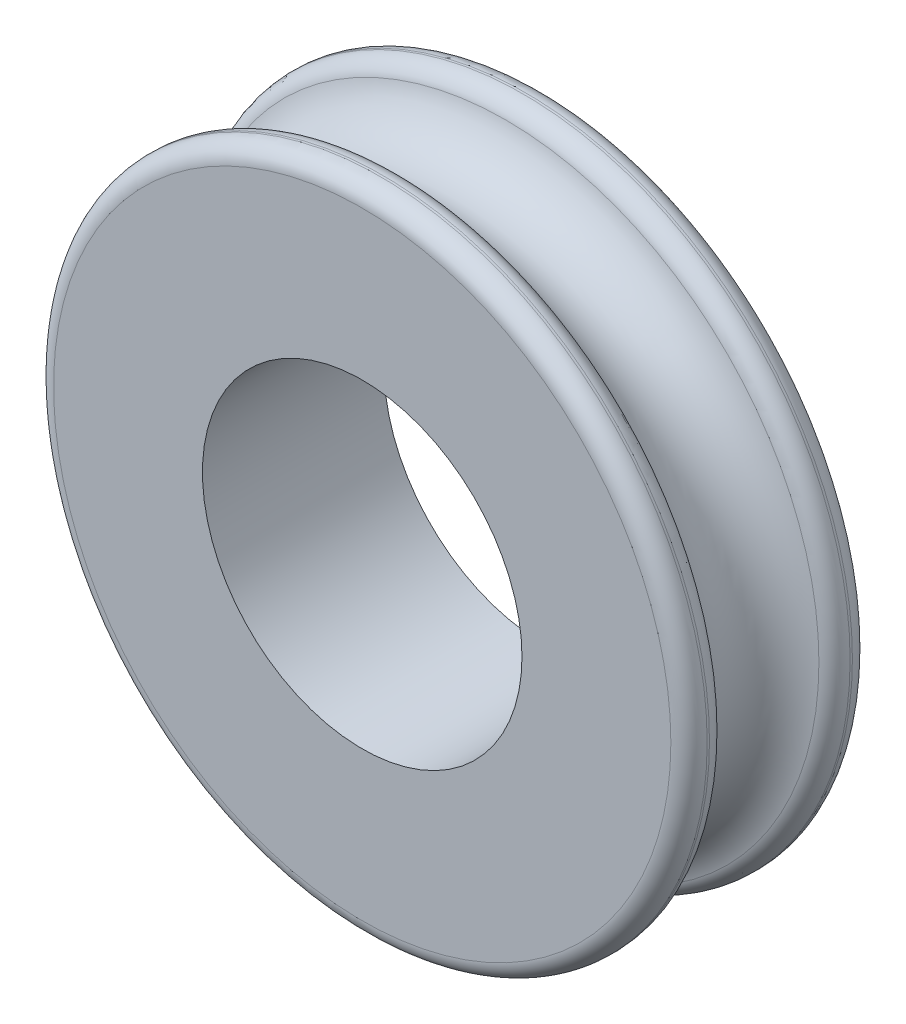
ISO-10303-21;
HEADER;
FILE_DESCRIPTION(('STEP AP214'),'2;1');
FILE_NAME('part.step','',(''),(''),'','','');
FILE_SCHEMA(('AUTOMOTIVE_DESIGN { 1 0 10303 214 1 1 1 1 }'));
ENDSEC;
DATA;
#1=APPLICATION_CONTEXT('core data for automotive mechanical design processes');
#2=APPLICATION_PROTOCOL_DEFINITION('international standard','automotive_design',2000,#1);
#3=PRODUCT_CONTEXT('',#1,'mechanical');
#4=PRODUCT('Part','Part','',(#3));
#5=PRODUCT_RELATED_PRODUCT_CATEGORY('part','',(#4));
#6=PRODUCT_DEFINITION_FORMATION('','',#4);
#7=PRODUCT_DEFINITION_CONTEXT('part definition',#1,'design');
#8=PRODUCT_DEFINITION('design','',#6,#7);
#9=PRODUCT_DEFINITION_SHAPE('','',#8);
#10=(LENGTH_UNIT() NAMED_UNIT(*) SI_UNIT(.MILLI.,.METRE.));
#11=(NAMED_UNIT(*) PLANE_ANGLE_UNIT() SI_UNIT($,.RADIAN.));
#12=(NAMED_UNIT(*) SI_UNIT($,.STERADIAN.) SOLID_ANGLE_UNIT());
#13=UNCERTAINTY_MEASURE_WITH_UNIT(LENGTH_MEASURE(1.E-05),#10,'distance_accuracy_value','');
#14=(GEOMETRIC_REPRESENTATION_CONTEXT(3) GLOBAL_UNCERTAINTY_ASSIGNED_CONTEXT((#13)) GLOBAL_UNIT_ASSIGNED_CONTEXT((#10,
#11,#12)) REPRESENTATION_CONTEXT('',''));
#15=CARTESIAN_POINT('',(0.,0.,0.));
#16=DIRECTION('',(0.,0.,1.));
#17=DIRECTION('',(1.,0.,0.));
#18=AXIS2_PLACEMENT_3D('',#15,#16,#17);
#19=CARTESIAN_POINT('',(0.,0.,2.5));
#20=DIRECTION('',(0.,0.,-1.));
#21=DIRECTION('',(-1.,0.,0.));
#22=AXIS2_PLACEMENT_3D('',#19,#20,#21);
#23=CYLINDRICAL_SURFACE('',#22,9.);
#24=CARTESIAN_POINT('',(0.,0.,1.93649167310371));
#25=DIRECTION('',(0.,0.,-1.));
#26=DIRECTION('',(-1.,0.,0.));
#27=AXIS2_PLACEMENT_3D('',#24,#25,#26);
#28=CIRCLE('',#27,9.);
#29=CARTESIAN_POINT('',(9.,0.,1.93649167310371));
#30=VERTEX_POINT('',#29);
#31=EDGE_CURVE('E69',#30,#30,#28,.F.);
#32=ORIENTED_EDGE('',*,*,#31,.T.);
#33=EDGE_LOOP('',(#32));
#34=FACE_BOUND('',#33,.T.);
#35=CARTESIAN_POINT('',(0.,0.,2.));
#36=DIRECTION('',(0.,0.,1.));
#37=DIRECTION('',(1.,0.,0.));
#38=AXIS2_PLACEMENT_3D('',#35,#36,#37);
#39=CIRCLE('',#38,9.);
#40=CARTESIAN_POINT('',(9.,0.,2.));
#41=VERTEX_POINT('',#40);
#42=EDGE_CURVE('E95',#41,#41,#39,.F.);
#43=ORIENTED_EDGE('',*,*,#42,.T.);
#44=EDGE_LOOP('',(#43));
#45=FACE_BOUND('',#44,.T.);
#46=ADVANCED_FACE('F39',(#34,#45),#23,.T.);
#47=CARTESIAN_POINT('',(0.,0.,2.5));
#48=DIRECTION('',(0.,0.,1.));
#49=DIRECTION('',(1.,0.,0.));
#50=AXIS2_PLACEMENT_3D('',#47,#48,#49);
#51=PLANE('',#50);
#52=CARTESIAN_POINT('',(0.,0.,2.5));
#53=DIRECTION('',(0.,0.,1.));
#54=DIRECTION('',(1.,0.,0.));
#55=AXIS2_PLACEMENT_3D('',#52,#53,#54);
#56=CIRCLE('',#55,8.5);
#57=CARTESIAN_POINT('',(8.5,0.,2.5));
#58=VERTEX_POINT('',#57);
#59=EDGE_CURVE('E99',#58,#58,#56,.T.);
#60=ORIENTED_EDGE('',*,*,#59,.T.);
#61=EDGE_LOOP('',(#60));
#62=FACE_BOUND('',#61,.T.);
#63=CARTESIAN_POINT('',(0.,0.,2.5));
#64=DIRECTION('',(0.,0.,1.));
#65=DIRECTION('',(1.,0.,0.));
#66=AXIS2_PLACEMENT_3D('',#63,#64,#65);
#67=CIRCLE('',#66,4.4);
#68=CARTESIAN_POINT('',(4.4,0.,2.5));
#69=VERTEX_POINT('',#68);
#70=EDGE_CURVE('E103',#69,#69,#67,.T.);
#71=ORIENTED_EDGE('',*,*,#70,.F.);
#72=EDGE_LOOP('',(#71));
#73=FACE_BOUND('',#72,.T.);
#74=ADVANCED_FACE('F114',(#62,#73),#51,.T.);
#75=CARTESIAN_POINT('',(0.,0.,-2.5));
#76=DIRECTION('',(0.,0.,1.));
#77=DIRECTION('',(1.,0.,0.));
#78=AXIS2_PLACEMENT_3D('',#75,#76,#77);
#79=PLANE('',#78);
#80=CARTESIAN_POINT('',(0.,0.,-2.5));
#81=DIRECTION('',(0.,0.,1.));
#82=DIRECTION('',(1.,0.,0.));
#83=AXIS2_PLACEMENT_3D('',#80,#81,#82);
#84=CIRCLE('',#83,8.5);
#85=CARTESIAN_POINT('',(8.5,0.,-2.5));
#86=VERTEX_POINT('',#85);
#87=EDGE_CURVE('E87',#86,#86,#84,.F.);
#88=ORIENTED_EDGE('',*,*,#87,.T.);
#89=EDGE_LOOP('',(#88));
#90=FACE_BOUND('',#89,.T.);
#91=CARTESIAN_POINT('',(0.,0.,-2.5));
#92=DIRECTION('',(0.,0.,1.));
#93=DIRECTION('',(1.,0.,0.));
#94=AXIS2_PLACEMENT_3D('',#91,#92,#93);
#95=CIRCLE('',#94,4.4);
#96=CARTESIAN_POINT('',(4.4,0.,-2.5));
#97=VERTEX_POINT('',#96);
#98=EDGE_CURVE('E76',#97,#97,#95,.T.);
#99=ORIENTED_EDGE('',*,*,#98,.T.);
#100=EDGE_LOOP('',(#99));
#101=FACE_BOUND('',#100,.T.);
#102=ADVANCED_FACE('F116',(#90,#101),#79,.F.);
#103=CARTESIAN_POINT('',(0.,0.,-1.93649167310371));
#104=DIRECTION('',(0.,0.,1.));
#105=DIRECTION('',(1.,0.,0.));
#106=AXIS2_PLACEMENT_3D('',#103,#104,#105);
#107=CIRCLE('',#106,9.);
#108=CARTESIAN_POINT('',(9.,0.,-1.93649167310371));
#109=VERTEX_POINT('',#108);
#110=EDGE_CURVE('E11',#109,#109,#107,.F.);
#111=ORIENTED_EDGE('',*,*,#110,.T.);
#112=EDGE_LOOP('',(#111));
#113=FACE_BOUND('',#112,.T.);
#114=CARTESIAN_POINT('',(0.,0.,-2.));
#115=DIRECTION('',(0.,0.,1.));
#116=DIRECTION('',(1.,0.,0.));
#117=AXIS2_PLACEMENT_3D('',#114,#115,#116);
#118=CIRCLE('',#117,9.);
#119=CARTESIAN_POINT('',(9.,0.,-2.));
#120=VERTEX_POINT('',#119);
#121=EDGE_CURVE('E91',#120,#120,#118,.T.);
#122=ORIENTED_EDGE('',*,*,#121,.T.);
#123=EDGE_LOOP('',(#122));
#124=FACE_BOUND('',#123,.T.);
#125=ADVANCED_FACE('F123',(#113,#124),#23,.T.);
#126=CARTESIAN_POINT('',(0.,0.,2.5));
#127=DIRECTION('',(0.,0.,-1.));
#128=DIRECTION('',(-1.,0.,0.));
#129=AXIS2_PLACEMENT_3D('',#126,#127,#128);
#130=CYLINDRICAL_SURFACE('',#129,4.4);
#131=ORIENTED_EDGE('',*,*,#70,.T.);
#132=EDGE_LOOP('',(#131));
#133=FACE_BOUND('',#132,.T.);
#134=ORIENTED_EDGE('',*,*,#98,.F.);
#135=EDGE_LOOP('',(#134));
#136=FACE_BOUND('',#135,.T.);
#137=ADVANCED_FACE('F111',(#133,#136),#130,.F.);
#138=CARTESIAN_POINT('',(0.,0.,0.));
#139=DIRECTION('',(0.,0.,1.));
#140=DIRECTION('',(1.,0.,0.));
#141=AXIS2_PLACEMENT_3D('',#138,#139,#140);
#142=TOROIDAL_SURFACE('',#141,9.,1.5);
#143=CARTESIAN_POINT('',(9.,0.,0.));
#144=DIRECTION('',(0.,1.,0.));
#145=DIRECTION('',(0.,0.,1.));
#146=AXIS2_PLACEMENT_3D('',#143,#144,#145);
#147=CIRCLE('',#146,1.5);
#148=CARTESIAN_POINT('',(8.62500000000016,0.,-1.45236875482787));
#149=VERTEX_POINT('',#148);
#150=CARTESIAN_POINT('',(8.62500000000005,0.,1.45236875482781));
#151=VERTEX_POINT('',#150);
#152=EDGE_CURVE('E72',#149,#151,#147,.T.);
#153=ORIENTED_EDGE('',*,*,#152,.T.);
#154=CARTESIAN_POINT('',(0.,0.,1.45236875482781));
#155=DIRECTION('',(0.,0.,-1.));
#156=DIRECTION('',(-1.,0.,0.));
#157=AXIS2_PLACEMENT_3D('',#154,#155,#156);
#158=CIRCLE('',#157,8.62499999999999);
#159=EDGE_CURVE('E49',#151,#151,#158,.T.);
#160=ORIENTED_EDGE('',*,*,#159,.T.);
#161=ORIENTED_EDGE('',*,*,#152,.F.);
#162=CARTESIAN_POINT('',(0.,0.,-1.45236875482787));
#163=DIRECTION('',(0.,0.,1.));
#164=DIRECTION('',(1.,0.,0.));
#165=AXIS2_PLACEMENT_3D('',#162,#163,#164);
#166=CIRCLE('',#165,8.62499999999998);
#167=EDGE_CURVE('E81',#149,#149,#166,.T.);
#168=ORIENTED_EDGE('',*,*,#167,.T.);
#169=EDGE_LOOP('',(#153,#160,#161,#168));
#170=FACE_BOUND('',#169,.T.);
#171=ADVANCED_FACE('F137',(#170),#142,.F.);
#172=CARTESIAN_POINT('',(0.,0.,2.));
#173=DIRECTION('',(0.,0.,1.));
#174=DIRECTION('',(1.,0.,0.));
#175=AXIS2_PLACEMENT_3D('',#172,#173,#174);
#176=TOROIDAL_SURFACE('',#175,8.5,0.5);
#177=ORIENTED_EDGE('',*,*,#42,.F.);
#178=EDGE_LOOP('',(#177));
#179=FACE_BOUND('',#178,.T.);
#180=ORIENTED_EDGE('',*,*,#59,.F.);
#181=EDGE_LOOP('',(#180));
#182=FACE_BOUND('',#181,.T.);
#183=ADVANCED_FACE('F133',(#179,#182),#176,.T.);
#184=CARTESIAN_POINT('',(0.,0.,-2.));
#185=DIRECTION('',(0.,0.,1.));
#186=DIRECTION('',(1.,0.,0.));
#187=AXIS2_PLACEMENT_3D('',#184,#185,#186);
#188=TOROIDAL_SURFACE('',#187,8.5,0.5);
#189=ORIENTED_EDGE('',*,*,#87,.F.);
#190=EDGE_LOOP('',(#189));
#191=FACE_BOUND('',#190,.T.);
#192=ORIENTED_EDGE('',*,*,#121,.F.);
#193=EDGE_LOOP('',(#192));
#194=FACE_BOUND('',#193,.T.);
#195=ADVANCED_FACE('F136',(#191,#194),#188,.T.);
#196=CARTESIAN_POINT('',(0.,0.,1.93649167310371));
#197=DIRECTION('',(0.,0.,-1.));
#198=DIRECTION('',(-1.,0.,0.));
#199=AXIS2_PLACEMENT_3D('',#196,#197,#198);
#200=TOROIDAL_SURFACE('',#199,8.5,0.5);
#201=CARTESIAN_POINT('',(8.5,0.,1.93649167310371));
#202=DIRECTION('',(0.,-1.,0.));
#203=DIRECTION('',(0.,0.,-1.));
#204=AXIS2_PLACEMENT_3D('',#201,#202,#203);
#205=CIRCLE('',#204,0.5);
#206=EDGE_CURVE('E63',#151,#30,#205,.T.);
#207=ORIENTED_EDGE('',*,*,#206,.F.);
#208=ORIENTED_EDGE('',*,*,#159,.F.);
#209=ORIENTED_EDGE('',*,*,#206,.T.);
#210=ORIENTED_EDGE('',*,*,#31,.F.);
#211=EDGE_LOOP('',(#207,#208,#209,#210));
#212=FACE_BOUND('',#211,.T.);
#213=ADVANCED_FACE('F67',(#212),#200,.T.);
#214=CARTESIAN_POINT('',(0.,0.,-1.93649167310371));
#215=DIRECTION('',(0.,0.,1.));
#216=DIRECTION('',(1.,0.,0.));
#217=AXIS2_PLACEMENT_3D('',#214,#215,#216);
#218=TOROIDAL_SURFACE('',#217,8.5,0.5);
#219=CARTESIAN_POINT('',(8.5,0.,-1.93649167310371));
#220=DIRECTION('',(0.,1.,0.));
#221=DIRECTION('',(0.,0.,1.));
#222=AXIS2_PLACEMENT_3D('',#219,#220,#221);
#223=CIRCLE('',#222,0.5);
#224=EDGE_CURVE('E43',#149,#109,#223,.T.);
#225=ORIENTED_EDGE('',*,*,#224,.F.);
#226=ORIENTED_EDGE('',*,*,#167,.F.);
#227=ORIENTED_EDGE('',*,*,#224,.T.);
#228=ORIENTED_EDGE('',*,*,#110,.F.);
#229=EDGE_LOOP('',(#225,#226,#227,#228));
#230=FACE_BOUND('',#229,.T.);
#231=ADVANCED_FACE('F41',(#230),#218,.T.);
#232=CLOSED_SHELL('',(#46,#74,#102,#125,#137,#171,#183,#195,#213,#231));
#233=MANIFOLD_SOLID_BREP('B2',#232);
#234=ADVANCED_BREP_SHAPE_REPRESENTATION('',(#18,#233),#14);
#235=SHAPE_DEFINITION_REPRESENTATION(#9,#234);
ENDSEC;
END-ISO-10303-21;
